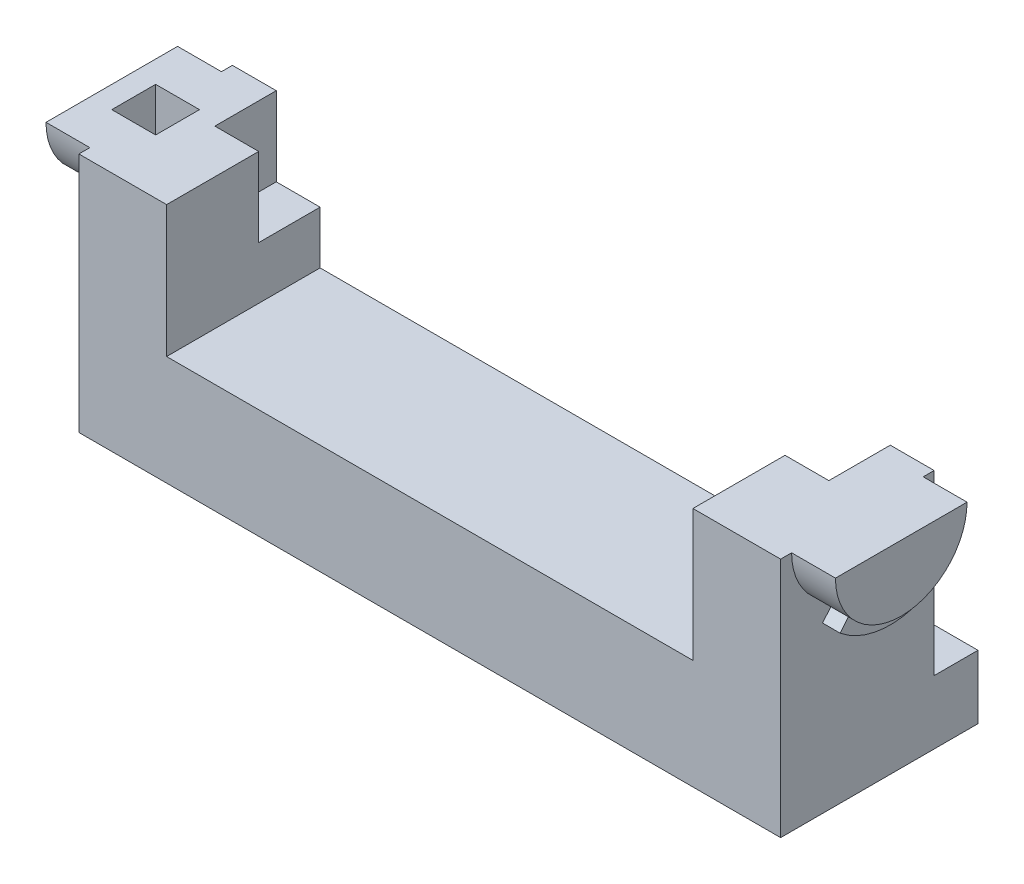
ISO-10303-21;
HEADER;
FILE_DESCRIPTION(('STEP AP214'),'2;1');
FILE_NAME('part.step','',(''),(''),'','','');
FILE_SCHEMA(('AUTOMOTIVE_DESIGN { 1 0 10303 214 1 1 1 1 }'));
ENDSEC;
DATA;
#1=APPLICATION_CONTEXT('core data for automotive mechanical design processes');
#2=APPLICATION_PROTOCOL_DEFINITION('international standard','automotive_design',2000,#1);
#3=PRODUCT_CONTEXT('',#1,'mechanical');
#4=PRODUCT('Part','Part','',(#3));
#5=PRODUCT_RELATED_PRODUCT_CATEGORY('part','',(#4));
#6=PRODUCT_DEFINITION_FORMATION('','',#4);
#7=PRODUCT_DEFINITION_CONTEXT('part definition',#1,'design');
#8=PRODUCT_DEFINITION('design','',#6,#7);
#9=PRODUCT_DEFINITION_SHAPE('','',#8);
#10=(LENGTH_UNIT() NAMED_UNIT(*) SI_UNIT(.MILLI.,.METRE.));
#11=(NAMED_UNIT(*) PLANE_ANGLE_UNIT() SI_UNIT($,.RADIAN.));
#12=(NAMED_UNIT(*) SI_UNIT($,.STERADIAN.) SOLID_ANGLE_UNIT());
#13=UNCERTAINTY_MEASURE_WITH_UNIT(LENGTH_MEASURE(1.E-05),#10,'distance_accuracy_value','');
#14=(GEOMETRIC_REPRESENTATION_CONTEXT(3) GLOBAL_UNCERTAINTY_ASSIGNED_CONTEXT((#13)) GLOBAL_UNIT_ASSIGNED_CONTEXT((#10,
#11,#12)) REPRESENTATION_CONTEXT('',''));
#15=CARTESIAN_POINT('',(0.,0.,0.));
#16=DIRECTION('',(0.,0.,1.));
#17=DIRECTION('',(1.,0.,0.));
#18=AXIS2_PLACEMENT_3D('',#15,#16,#17);
#19=CARTESIAN_POINT('',(0.,6.35,8.89));
#20=DIRECTION('',(0.,-1.,0.));
#21=DIRECTION('',(0.,0.,-1.));
#22=AXIS2_PLACEMENT_3D('',#19,#20,#21);
#23=PLANE('',#22);
#24=DIRECTION('',(0.,0.,1.));
#25=VECTOR('',#24,1.);
#26=CARTESIAN_POINT('',(35.56,6.35,8.89));
#27=LINE('',#26,#25);
#28=CARTESIAN_POINT('',(35.56,6.35,0.));
#29=VERTEX_POINT('',#28);
#30=CARTESIAN_POINT('',(35.56,6.35,8.89));
#31=VERTEX_POINT('',#30);
#32=EDGE_CURVE('E455',#29,#31,#27,.T.);
#33=ORIENTED_EDGE('',*,*,#32,.F.);
#34=DIRECTION('',(-1.,0.,0.));
#35=VECTOR('',#34,1.);
#36=CARTESIAN_POINT('',(0.,6.35,0.));
#37=LINE('',#36,#35);
#38=CARTESIAN_POINT('',(5.08,6.35,0.));
#39=VERTEX_POINT('',#38);
#40=EDGE_CURVE('E502',#29,#39,#37,.T.);
#41=ORIENTED_EDGE('',*,*,#40,.T.);
#42=DIRECTION('',(0.,0.,-1.));
#43=VECTOR('',#42,1.);
#44=CARTESIAN_POINT('',(5.08,6.35,8.89));
#45=LINE('',#44,#43);
#46=CARTESIAN_POINT('',(5.08,6.35,8.89));
#47=VERTEX_POINT('',#46);
#48=EDGE_CURVE('E478',#47,#39,#45,.T.);
#49=ORIENTED_EDGE('',*,*,#48,.F.);
#50=DIRECTION('',(-1.,0.,0.));
#51=VECTOR('',#50,1.);
#52=CARTESIAN_POINT('',(0.,6.35,8.89));
#53=LINE('',#52,#51);
#54=EDGE_CURVE('E506',#31,#47,#53,.T.);
#55=ORIENTED_EDGE('',*,*,#54,.F.);
#56=EDGE_LOOP('',(#33,#41,#49,#55));
#57=FACE_BOUND('',#56,.T.);
#58=ADVANCED_FACE('F51',(#57),#23,.F.);
#59=CARTESIAN_POINT('',(0.,0.,8.89));
#60=DIRECTION('',(1.,0.,0.));
#61=DIRECTION('',(0.,0.,-1.));
#62=AXIS2_PLACEMENT_3D('',#59,#60,#61);
#63=PLANE('',#62);
#64=CARTESIAN_POINT('',(0.,13.97,4.445));
#65=DIRECTION('',(-1.,0.,0.));
#66=DIRECTION('',(0.,0.,-1.));
#67=AXIS2_PLACEMENT_3D('',#64,#65,#66);
#68=CIRCLE('',#67,3.81);
#69=CARTESIAN_POINT('',(0.,13.97,0.635));
#70=VERTEX_POINT('',#69);
#71=CARTESIAN_POINT('',(0.,13.97,8.255));
#72=VERTEX_POINT('',#71);
#73=EDGE_CURVE('E421',#70,#72,#68,.T.);
#74=ORIENTED_EDGE('',*,*,#73,.F.);
#75=DIRECTION('',(0.,0.,1.));
#76=VECTOR('',#75,1.);
#77=CARTESIAN_POINT('',(0.,13.97,8.89));
#78=LINE('',#77,#76);
#79=CARTESIAN_POINT('',(0.,13.97,0.));
#80=VERTEX_POINT('',#79);
#81=EDGE_CURVE('E479',#80,#70,#78,.T.);
#82=ORIENTED_EDGE('',*,*,#81,.F.);
#83=DIRECTION('',(0.,-1.,0.));
#84=VECTOR('',#83,1.);
#85=CARTESIAN_POINT('',(0.,0.,0.));
#86=LINE('',#85,#84);
#87=CARTESIAN_POINT('',(0.,3.683,0.));
#88=VERTEX_POINT('',#87);
#89=EDGE_CURVE('E497',#80,#88,#86,.T.);
#90=ORIENTED_EDGE('',*,*,#89,.T.);
#91=DIRECTION('',(0.,0.,1.));
#92=VECTOR('',#91,1.);
#93=CARTESIAN_POINT('',(0.,3.683,-2.54));
#94=LINE('',#93,#92);
#95=CARTESIAN_POINT('',(0.,3.683,-2.54));
#96=VERTEX_POINT('',#95);
#97=EDGE_CURVE('E418',#96,#88,#94,.T.);
#98=ORIENTED_EDGE('',*,*,#97,.F.);
#99=DIRECTION('',(0.,1.,0.));
#100=VECTOR('',#99,1.);
#101=CARTESIAN_POINT('',(0.,0.,-2.54));
#102=LINE('',#101,#100);
#103=CARTESIAN_POINT('',(0.,0.,-2.54));
#104=VERTEX_POINT('',#103);
#105=EDGE_CURVE('E401',#104,#96,#102,.T.);
#106=ORIENTED_EDGE('',*,*,#105,.F.);
#107=DIRECTION('',(0.,0.,-1.));
#108=VECTOR('',#107,1.);
#109=CARTESIAN_POINT('',(0.,0.,8.89));
#110=LINE('',#109,#108);
#111=CARTESIAN_POINT('',(0.,0.,8.89));
#112=VERTEX_POINT('',#111);
#113=EDGE_CURVE('E12',#112,#104,#110,.T.);
#114=ORIENTED_EDGE('',*,*,#113,.F.);
#115=DIRECTION('',(0.,-1.,0.));
#116=VECTOR('',#115,1.);
#117=CARTESIAN_POINT('',(0.,0.,8.89));
#118=LINE('',#117,#116);
#119=CARTESIAN_POINT('',(0.,13.97,8.89));
#120=VERTEX_POINT('',#119);
#121=EDGE_CURVE('E498',#120,#112,#118,.T.);
#122=ORIENTED_EDGE('',*,*,#121,.F.);
#123=EDGE_CURVE('E483',#72,#120,#78,.T.);
#124=ORIENTED_EDGE('',*,*,#123,.F.);
#125=EDGE_LOOP('',(#74,#82,#90,#98,#106,#114,#122,#124));
#126=FACE_BOUND('',#125,.T.);
#127=ADVANCED_FACE('F53',(#126),#63,.F.);
#128=CARTESIAN_POINT('',(0.,0.,8.89));
#129=DIRECTION('',(0.,1.,0.));
#130=DIRECTION('',(0.,0.,1.));
#131=AXIS2_PLACEMENT_3D('',#128,#129,#130);
#132=PLANE('',#131);
#133=DIRECTION('',(-1.,0.,0.));
#134=VECTOR('',#133,1.);
#135=CARTESIAN_POINT('',(20.574,0.,3.81));
#136=LINE('',#135,#134);
#137=CARTESIAN_POINT('',(20.574,0.,3.81));
#138=VERTEX_POINT('',#137);
#139=CARTESIAN_POINT('',(20.066,0.,3.81));
#140=VERTEX_POINT('',#139);
#141=EDGE_CURVE('E313',#138,#140,#136,.T.);
#142=ORIENTED_EDGE('',*,*,#141,.F.);
#143=DIRECTION('',(0.,0.,1.));
#144=VECTOR('',#143,1.);
#145=CARTESIAN_POINT('',(20.574,0.,-2.54));
#146=LINE('',#145,#144);
#147=CARTESIAN_POINT('',(20.574,0.,-2.54));
#148=VERTEX_POINT('',#147);
#149=EDGE_CURVE('E297',#148,#138,#146,.T.);
#150=ORIENTED_EDGE('',*,*,#149,.F.);
#151=DIRECTION('',(-1.,0.,0.));
#152=VECTOR('',#151,1.);
#153=CARTESIAN_POINT('',(0.,0.,-2.54));
#154=LINE('',#153,#152);
#155=CARTESIAN_POINT('',(40.64,0.,-2.54));
#156=VERTEX_POINT('',#155);
#157=EDGE_CURVE('E410',#156,#148,#154,.T.);
#158=ORIENTED_EDGE('',*,*,#157,.F.);
#159=DIRECTION('',(0.,0.,-1.));
#160=VECTOR('',#159,1.);
#161=CARTESIAN_POINT('',(40.64,0.,8.89));
#162=LINE('',#161,#160);
#163=CARTESIAN_POINT('',(40.64,0.,8.89));
#164=VERTEX_POINT('',#163);
#165=EDGE_CURVE('E59',#164,#156,#162,.T.);
#166=ORIENTED_EDGE('',*,*,#165,.F.);
#167=DIRECTION('',(1.,0.,0.));
#168=VECTOR('',#167,1.);
#169=CARTESIAN_POINT('',(0.,0.,8.89));
#170=LINE('',#169,#168);
#171=EDGE_CURVE('E501',#112,#164,#170,.T.);
#172=ORIENTED_EDGE('',*,*,#171,.F.);
#173=ORIENTED_EDGE('',*,*,#113,.T.);
#174=CARTESIAN_POINT('',(20.066,0.,-2.54));
#175=VERTEX_POINT('',#174);
#176=EDGE_CURVE('E409',#175,#104,#154,.T.);
#177=ORIENTED_EDGE('',*,*,#176,.F.);
#178=DIRECTION('',(0.,0.,-1.));
#179=VECTOR('',#178,1.);
#180=CARTESIAN_POINT('',(20.066,0.,-2.54));
#181=LINE('',#180,#179);
#182=EDGE_CURVE('E305',#140,#175,#181,.T.);
#183=ORIENTED_EDGE('',*,*,#182,.F.);
#184=EDGE_LOOP('',(#142,#150,#158,#166,#172,#173,#177,#183));
#185=FACE_BOUND('',#184,.T.);
#186=ADVANCED_FACE('F528',(#185),#132,.F.);
#187=CARTESIAN_POINT('',(40.64,0.,8.89));
#188=DIRECTION('',(-1.,0.,0.));
#189=DIRECTION('',(0.,0.,1.));
#190=AXIS2_PLACEMENT_3D('',#187,#188,#189);
#191=PLANE('',#190);
#192=CARTESIAN_POINT('',(40.64,13.97,4.445));
#193=DIRECTION('',(1.,0.,0.));
#194=DIRECTION('',(0.,0.,-1.));
#195=AXIS2_PLACEMENT_3D('',#192,#193,#194);
#196=CIRCLE('',#195,3.81);
#197=CARTESIAN_POINT('',(40.64,13.97,8.255));
#198=VERTEX_POINT('',#197);
#199=CARTESIAN_POINT('',(40.64,13.97,0.635));
#200=VERTEX_POINT('',#199);
#201=EDGE_CURVE('E363',#198,#200,#196,.T.);
#202=ORIENTED_EDGE('',*,*,#201,.F.);
#203=DIRECTION('',(0.,0.,-1.));
#204=VECTOR('',#203,1.);
#205=CARTESIAN_POINT('',(40.64,13.97,8.89));
#206=LINE('',#205,#204);
#207=CARTESIAN_POINT('',(40.64,13.97,8.89));
#208=VERTEX_POINT('',#207);
#209=EDGE_CURVE('E459',#208,#198,#206,.T.);
#210=ORIENTED_EDGE('',*,*,#209,.F.);
#211=DIRECTION('',(0.,1.,0.));
#212=VECTOR('',#211,1.);
#213=CARTESIAN_POINT('',(40.64,0.,8.89));
#214=LINE('',#213,#212);
#215=EDGE_CURVE('E504',#164,#208,#214,.T.);
#216=ORIENTED_EDGE('',*,*,#215,.F.);
#217=ORIENTED_EDGE('',*,*,#165,.T.);
#218=DIRECTION('',(0.,-1.,0.));
#219=VECTOR('',#218,1.);
#220=CARTESIAN_POINT('',(40.64,0.,-2.54));
#221=LINE('',#220,#219);
#222=CARTESIAN_POINT('',(40.64,3.683,-2.54));
#223=VERTEX_POINT('',#222);
#224=EDGE_CURVE('E406',#223,#156,#221,.T.);
#225=ORIENTED_EDGE('',*,*,#224,.F.);
#226=DIRECTION('',(0.,0.,1.));
#227=VECTOR('',#226,1.);
#228=CARTESIAN_POINT('',(40.64,3.683,-2.54));
#229=LINE('',#228,#227);
#230=CARTESIAN_POINT('',(40.64,3.683,0.));
#231=VERTEX_POINT('',#230);
#232=EDGE_CURVE('E413',#223,#231,#229,.T.);
#233=ORIENTED_EDGE('',*,*,#232,.T.);
#234=DIRECTION('',(0.,1.,0.));
#235=VECTOR('',#234,1.);
#236=CARTESIAN_POINT('',(40.64,0.,0.));
#237=LINE('',#236,#235);
#238=CARTESIAN_POINT('',(40.64,13.97,0.));
#239=VERTEX_POINT('',#238);
#240=EDGE_CURVE('E510',#231,#239,#237,.T.);
#241=ORIENTED_EDGE('',*,*,#240,.T.);
#242=EDGE_CURVE('E463',#200,#239,#206,.T.);
#243=ORIENTED_EDGE('',*,*,#242,.F.);
#244=EDGE_LOOP('',(#202,#210,#216,#217,#225,#233,#241,#243));
#245=FACE_BOUND('',#244,.T.);
#246=ADVANCED_FACE('F518',(#245),#191,.F.);
#247=CARTESIAN_POINT('',(0.,0.,8.89));
#248=DIRECTION('',(0.,0.,-1.));
#249=DIRECTION('',(-1.,0.,0.));
#250=AXIS2_PLACEMENT_3D('',#247,#248,#249);
#251=PLANE('',#250);
#252=ORIENTED_EDGE('',*,*,#121,.T.);
#253=ORIENTED_EDGE('',*,*,#171,.T.);
#254=ORIENTED_EDGE('',*,*,#215,.T.);
#255=DIRECTION('',(1.,0.,0.));
#256=VECTOR('',#255,1.);
#257=CARTESIAN_POINT('',(40.64,13.97,8.89));
#258=LINE('',#257,#256);
#259=CARTESIAN_POINT('',(35.56,13.97,8.89));
#260=VERTEX_POINT('',#259);
#261=EDGE_CURVE('E468',#260,#208,#258,.T.);
#262=ORIENTED_EDGE('',*,*,#261,.F.);
#263=DIRECTION('',(0.,-1.,0.));
#264=VECTOR('',#263,1.);
#265=CARTESIAN_POINT('',(35.56,13.97,8.89));
#266=LINE('',#265,#264);
#267=EDGE_CURVE('E471',#260,#31,#266,.T.);
#268=ORIENTED_EDGE('',*,*,#267,.T.);
#269=ORIENTED_EDGE('',*,*,#54,.T.);
#270=DIRECTION('',(0.,-1.,0.));
#271=VECTOR('',#270,1.);
#272=CARTESIAN_POINT('',(5.08,13.97,8.89));
#273=LINE('',#272,#271);
#274=CARTESIAN_POINT('',(5.08,13.97,8.89));
#275=VERTEX_POINT('',#274);
#276=EDGE_CURVE('E494',#275,#47,#273,.T.);
#277=ORIENTED_EDGE('',*,*,#276,.F.);
#278=DIRECTION('',(1.,0.,0.));
#279=VECTOR('',#278,1.);
#280=CARTESIAN_POINT('',(0.,13.97,8.89));
#281=LINE('',#280,#279);
#282=EDGE_CURVE('E482',#120,#275,#281,.T.);
#283=ORIENTED_EDGE('',*,*,#282,.F.);
#284=EDGE_LOOP('',(#252,#253,#254,#262,#268,#269,#277,#283));
#285=FACE_BOUND('',#284,.T.);
#286=ADVANCED_FACE('F565',(#285),#251,.F.);
#287=CARTESIAN_POINT('',(0.,0.,0.));
#288=DIRECTION('',(0.,0.,-1.));
#289=DIRECTION('',(-1.,0.,0.));
#290=AXIS2_PLACEMENT_3D('',#287,#288,#289);
#291=PLANE('',#290);
#292=DIRECTION('',(-1.,0.,0.));
#293=VECTOR('',#292,1.);
#294=CARTESIAN_POINT('',(38.1,10.414,0.));
#295=LINE('',#294,#293);
#296=CARTESIAN_POINT('',(38.1,10.414,0.));
#297=VERTEX_POINT('',#296);
#298=CARTESIAN_POINT('',(35.56,10.414,0.));
#299=VERTEX_POINT('',#298);
#300=EDGE_CURVE('E390',#297,#299,#295,.T.);
#301=ORIENTED_EDGE('',*,*,#300,.F.);
#302=DIRECTION('',(0.,-1.,0.));
#303=VECTOR('',#302,1.);
#304=CARTESIAN_POINT('',(38.1,13.97,0.));
#305=LINE('',#304,#303);
#306=CARTESIAN_POINT('',(38.1,13.97,0.));
#307=VERTEX_POINT('',#306);
#308=EDGE_CURVE('E379',#307,#297,#305,.T.);
#309=ORIENTED_EDGE('',*,*,#308,.F.);
#310=DIRECTION('',(-1.,0.,0.));
#311=VECTOR('',#310,1.);
#312=CARTESIAN_POINT('',(40.64,13.97,0.));
#313=LINE('',#312,#311);
#314=EDGE_CURVE('E462',#239,#307,#313,.T.);
#315=ORIENTED_EDGE('',*,*,#314,.F.);
#316=ORIENTED_EDGE('',*,*,#240,.F.);
#317=DIRECTION('',(1.,0.,0.));
#318=VECTOR('',#317,1.);
#319=CARTESIAN_POINT('',(0.,3.683,0.));
#320=LINE('',#319,#318);
#321=EDGE_CURVE('E397',#88,#231,#320,.T.);
#322=ORIENTED_EDGE('',*,*,#321,.F.);
#323=ORIENTED_EDGE('',*,*,#89,.F.);
#324=DIRECTION('',(-1.,0.,0.));
#325=VECTOR('',#324,1.);
#326=CARTESIAN_POINT('',(0.,13.97,0.));
#327=LINE('',#326,#325);
#328=CARTESIAN_POINT('',(2.54,13.97,0.));
#329=VERTEX_POINT('',#328);
#330=EDGE_CURVE('E488',#329,#80,#327,.T.);
#331=ORIENTED_EDGE('',*,*,#330,.F.);
#332=DIRECTION('',(0.,1.,0.));
#333=VECTOR('',#332,1.);
#334=CARTESIAN_POINT('',(2.54,13.97,0.));
#335=LINE('',#334,#333);
#336=CARTESIAN_POINT('',(2.54,9.398,0.));
#337=VERTEX_POINT('',#336);
#338=EDGE_CURVE('E436',#337,#329,#335,.T.);
#339=ORIENTED_EDGE('',*,*,#338,.F.);
#340=DIRECTION('',(1.,0.,0.));
#341=VECTOR('',#340,1.);
#342=CARTESIAN_POINT('',(2.54,9.398,0.));
#343=LINE('',#342,#341);
#344=CARTESIAN_POINT('',(5.08,9.398,0.));
#345=VERTEX_POINT('',#344);
#346=EDGE_CURVE('E452',#337,#345,#343,.T.);
#347=ORIENTED_EDGE('',*,*,#346,.T.);
#348=DIRECTION('',(0.,-1.,0.));
#349=VECTOR('',#348,1.);
#350=CARTESIAN_POINT('',(5.08,13.97,0.));
#351=LINE('',#350,#349);
#352=EDGE_CURVE('E490',#345,#39,#351,.T.);
#353=ORIENTED_EDGE('',*,*,#352,.T.);
#354=ORIENTED_EDGE('',*,*,#40,.F.);
#355=DIRECTION('',(0.,-1.,0.));
#356=VECTOR('',#355,1.);
#357=CARTESIAN_POINT('',(35.56,13.97,0.));
#358=LINE('',#357,#356);
#359=EDGE_CURVE('E476',#299,#29,#358,.T.);
#360=ORIENTED_EDGE('',*,*,#359,.F.);
#361=EDGE_LOOP('',(#301,#309,#315,#316,#322,#323,#331,#339,#347,#353,#354,#360));
#362=FACE_BOUND('',#361,.T.);
#363=ADVANCED_FACE('F552',(#362),#291,.T.);
#364=CARTESIAN_POINT('',(5.08,13.97,8.89));
#365=DIRECTION('',(-1.,0.,0.));
#366=DIRECTION('',(0.,0.,1.));
#367=AXIS2_PLACEMENT_3D('',#364,#365,#366);
#368=PLANE('',#367);
#369=ORIENTED_EDGE('',*,*,#352,.F.);
#370=DIRECTION('',(0.,0.,-1.));
#371=VECTOR('',#370,1.);
#372=CARTESIAN_POINT('',(5.08,9.398,0.));
#373=LINE('',#372,#371);
#374=CARTESIAN_POINT('',(5.08,9.398,3.556));
#375=VERTEX_POINT('',#374);
#376=EDGE_CURVE('E439',#375,#345,#373,.T.);
#377=ORIENTED_EDGE('',*,*,#376,.F.);
#378=DIRECTION('',(0.,-1.,0.));
#379=VECTOR('',#378,1.);
#380=CARTESIAN_POINT('',(5.08,13.97,3.556));
#381=LINE('',#380,#379);
#382=CARTESIAN_POINT('',(5.08,13.97,3.556));
#383=VERTEX_POINT('',#382);
#384=EDGE_CURVE('E435',#383,#375,#381,.T.);
#385=ORIENTED_EDGE('',*,*,#384,.F.);
#386=DIRECTION('',(0.,0.,-1.));
#387=VECTOR('',#386,1.);
#388=CARTESIAN_POINT('',(5.08,13.97,8.89));
#389=LINE('',#388,#387);
#390=EDGE_CURVE('E485',#275,#383,#389,.T.);
#391=ORIENTED_EDGE('',*,*,#390,.F.);
#392=ORIENTED_EDGE('',*,*,#276,.T.);
#393=ORIENTED_EDGE('',*,*,#48,.T.);
#394=EDGE_LOOP('',(#369,#377,#385,#391,#392,#393));
#395=FACE_BOUND('',#394,.T.);
#396=ADVANCED_FACE('F589',(#395),#368,.F.);
#397=CARTESIAN_POINT('',(0.,13.97,0.));
#398=DIRECTION('',(0.,-1.,0.));
#399=DIRECTION('',(0.,0.,-1.));
#400=AXIS2_PLACEMENT_3D('',#397,#398,#399);
#401=PLANE('',#400);
#402=DIRECTION('',(1.,0.,0.));
#403=VECTOR('',#402,1.);
#404=CARTESIAN_POINT('',(-1.27,13.97,5.715));
#405=LINE('',#404,#403);
#406=CARTESIAN_POINT('',(-1.27,13.97,5.715));
#407=VERTEX_POINT('',#406);
#408=CARTESIAN_POINT('',(1.27,13.97,5.715));
#409=VERTEX_POINT('',#408);
#410=EDGE_CURVE('E291',#407,#409,#405,.T.);
#411=ORIENTED_EDGE('',*,*,#410,.F.);
#412=DIRECTION('',(0.,0.,1.));
#413=VECTOR('',#412,1.);
#414=CARTESIAN_POINT('',(-1.27,13.97,5.715));
#415=LINE('',#414,#413);
#416=CARTESIAN_POINT('',(-1.27,13.97,3.175));
#417=VERTEX_POINT('',#416);
#418=EDGE_CURVE('E66',#417,#407,#415,.T.);
#419=ORIENTED_EDGE('',*,*,#418,.F.);
#420=DIRECTION('',(-1.,0.,0.));
#421=VECTOR('',#420,1.);
#422=CARTESIAN_POINT('',(-1.27,13.97,3.175));
#423=LINE('',#422,#421);
#424=CARTESIAN_POINT('',(1.27,13.97,3.175));
#425=VERTEX_POINT('',#424);
#426=EDGE_CURVE('E282',#425,#417,#423,.T.);
#427=ORIENTED_EDGE('',*,*,#426,.F.);
#428=DIRECTION('',(0.,0.,-1.));
#429=VECTOR('',#428,1.);
#430=CARTESIAN_POINT('',(1.27,13.97,5.715));
#431=LINE('',#430,#429);
#432=EDGE_CURVE('E285',#409,#425,#431,.T.);
#433=ORIENTED_EDGE('',*,*,#432,.F.);
#434=EDGE_LOOP('',(#411,#419,#427,#433));
#435=FACE_BOUND('',#434,.T.);
#436=ORIENTED_EDGE('',*,*,#390,.T.);
#437=DIRECTION('',(1.,0.,0.));
#438=VECTOR('',#437,1.);
#439=CARTESIAN_POINT('',(2.54,13.97,3.556));
#440=LINE('',#439,#438);
#441=CARTESIAN_POINT('',(2.54,13.97,3.556));
#442=VERTEX_POINT('',#441);
#443=EDGE_CURVE('E448',#442,#383,#440,.T.);
#444=ORIENTED_EDGE('',*,*,#443,.F.);
#445=DIRECTION('',(0.,0.,1.));
#446=VECTOR('',#445,1.);
#447=CARTESIAN_POINT('',(2.54,13.97,0.));
#448=LINE('',#447,#446);
#449=EDGE_CURVE('E438',#329,#442,#448,.T.);
#450=ORIENTED_EDGE('',*,*,#449,.F.);
#451=ORIENTED_EDGE('',*,*,#330,.T.);
#452=ORIENTED_EDGE('',*,*,#81,.T.);
#453=DIRECTION('',(1.,0.,0.));
#454=VECTOR('',#453,1.);
#455=CARTESIAN_POINT('',(-2.54,13.97,0.635));
#456=LINE('',#455,#454);
#457=CARTESIAN_POINT('',(-2.54,13.97,0.635));
#458=VERTEX_POINT('',#457);
#459=EDGE_CURVE('E427',#458,#70,#456,.T.);
#460=ORIENTED_EDGE('',*,*,#459,.F.);
#461=DIRECTION('',(0.,0.,-1.));
#462=VECTOR('',#461,1.);
#463=CARTESIAN_POINT('',(-2.54,13.97,8.255));
#464=LINE('',#463,#462);
#465=CARTESIAN_POINT('',(-2.54,13.97,8.255));
#466=VERTEX_POINT('',#465);
#467=EDGE_CURVE('E425',#466,#458,#464,.T.);
#468=ORIENTED_EDGE('',*,*,#467,.F.);
#469=DIRECTION('',(1.,0.,0.));
#470=VECTOR('',#469,1.);
#471=CARTESIAN_POINT('',(-2.54,13.97,8.255));
#472=LINE('',#471,#470);
#473=EDGE_CURVE('E432',#466,#72,#472,.T.);
#474=ORIENTED_EDGE('',*,*,#473,.T.);
#475=ORIENTED_EDGE('',*,*,#123,.T.);
#476=ORIENTED_EDGE('',*,*,#282,.T.);
#477=EDGE_LOOP('',(#436,#444,#450,#451,#452,#460,#468,#474,#475,#476));
#478=FACE_BOUND('',#477,.T.);
#479=ADVANCED_FACE('F571',(#435,#478),#401,.F.);
#480=CARTESIAN_POINT('',(35.56,13.97,8.89));
#481=DIRECTION('',(1.,0.,0.));
#482=DIRECTION('',(0.,0.,-1.));
#483=AXIS2_PLACEMENT_3D('',#480,#481,#482);
#484=PLANE('',#483);
#485=DIRECTION('',(0.,0.,1.));
#486=VECTOR('',#485,1.);
#487=CARTESIAN_POINT('',(35.56,13.97,8.89));
#488=LINE('',#487,#486);
#489=CARTESIAN_POINT('',(35.56,13.97,3.556));
#490=VERTEX_POINT('',#489);
#491=EDGE_CURVE('E466',#490,#260,#488,.T.);
#492=ORIENTED_EDGE('',*,*,#491,.F.);
#493=DIRECTION('',(0.,1.,0.));
#494=VECTOR('',#493,1.);
#495=CARTESIAN_POINT('',(35.56,13.97,3.556));
#496=LINE('',#495,#494);
#497=CARTESIAN_POINT('',(35.56,10.414,3.556));
#498=VERTEX_POINT('',#497);
#499=EDGE_CURVE('E383',#498,#490,#496,.T.);
#500=ORIENTED_EDGE('',*,*,#499,.F.);
#501=DIRECTION('',(0.,0.,1.));
#502=VECTOR('',#501,1.);
#503=CARTESIAN_POINT('',(35.56,10.414,0.));
#504=LINE('',#503,#502);
#505=EDGE_CURVE('E378',#299,#498,#504,.T.);
#506=ORIENTED_EDGE('',*,*,#505,.F.);
#507=ORIENTED_EDGE('',*,*,#359,.T.);
#508=ORIENTED_EDGE('',*,*,#32,.T.);
#509=ORIENTED_EDGE('',*,*,#267,.F.);
#510=EDGE_LOOP('',(#492,#500,#506,#507,#508,#509));
#511=FACE_BOUND('',#510,.T.);
#512=ADVANCED_FACE('F597',(#511),#484,.F.);
#513=CARTESIAN_POINT('',(0.,13.97,0.));
#514=DIRECTION('',(0.,1.,0.));
#515=DIRECTION('',(0.,0.,1.));
#516=AXIS2_PLACEMENT_3D('',#513,#514,#515);
#517=PLANE('',#516);
#518=DIRECTION('',(-1.,0.,0.));
#519=VECTOR('',#518,1.);
#520=CARTESIAN_POINT('',(38.1,13.97,3.556));
#521=LINE('',#520,#519);
#522=CARTESIAN_POINT('',(38.1,13.97,3.556));
#523=VERTEX_POINT('',#522);
#524=EDGE_CURVE('E394',#523,#490,#521,.T.);
#525=ORIENTED_EDGE('',*,*,#524,.T.);
#526=ORIENTED_EDGE('',*,*,#491,.T.);
#527=ORIENTED_EDGE('',*,*,#261,.T.);
#528=ORIENTED_EDGE('',*,*,#209,.T.);
#529=DIRECTION('',(-1.,0.,0.));
#530=VECTOR('',#529,1.);
#531=CARTESIAN_POINT('',(43.18,13.97,8.255));
#532=LINE('',#531,#530);
#533=CARTESIAN_POINT('',(43.18,13.97,8.255));
#534=VERTEX_POINT('',#533);
#535=EDGE_CURVE('E370',#534,#198,#532,.T.);
#536=ORIENTED_EDGE('',*,*,#535,.F.);
#537=DIRECTION('',(0.,0.,1.));
#538=VECTOR('',#537,1.);
#539=CARTESIAN_POINT('',(43.18,13.97,0.635));
#540=LINE('',#539,#538);
#541=CARTESIAN_POINT('',(43.18,13.97,0.635));
#542=VERTEX_POINT('',#541);
#543=EDGE_CURVE('E368',#542,#534,#540,.T.);
#544=ORIENTED_EDGE('',*,*,#543,.F.);
#545=DIRECTION('',(-1.,0.,0.));
#546=VECTOR('',#545,1.);
#547=CARTESIAN_POINT('',(43.18,13.97,0.635));
#548=LINE('',#547,#546);
#549=EDGE_CURVE('E375',#542,#200,#548,.T.);
#550=ORIENTED_EDGE('',*,*,#549,.T.);
#551=ORIENTED_EDGE('',*,*,#242,.T.);
#552=ORIENTED_EDGE('',*,*,#314,.T.);
#553=DIRECTION('',(0.,0.,-1.));
#554=VECTOR('',#553,1.);
#555=CARTESIAN_POINT('',(38.1,13.97,0.));
#556=LINE('',#555,#554);
#557=EDGE_CURVE('E388',#523,#307,#556,.T.);
#558=ORIENTED_EDGE('',*,*,#557,.F.);
#559=EDGE_LOOP('',(#525,#526,#527,#528,#536,#544,#550,#551,#552,#558));
#560=FACE_BOUND('',#559,.T.);
#561=ADVANCED_FACE('F555',(#560),#517,.T.);
#562=CARTESIAN_POINT('',(2.54,9.398,0.));
#563=DIRECTION('',(0.,-1.,0.));
#564=DIRECTION('',(0.,0.,-1.));
#565=AXIS2_PLACEMENT_3D('',#562,#563,#564);
#566=PLANE('',#565);
#567=ORIENTED_EDGE('',*,*,#376,.T.);
#568=ORIENTED_EDGE('',*,*,#346,.F.);
#569=DIRECTION('',(0.,0.,-1.));
#570=VECTOR('',#569,1.);
#571=CARTESIAN_POINT('',(2.54,9.398,0.));
#572=LINE('',#571,#570);
#573=CARTESIAN_POINT('',(2.54,9.398,3.556));
#574=VERTEX_POINT('',#573);
#575=EDGE_CURVE('E445',#574,#337,#572,.T.);
#576=ORIENTED_EDGE('',*,*,#575,.F.);
#577=DIRECTION('',(1.,0.,0.));
#578=VECTOR('',#577,1.);
#579=CARTESIAN_POINT('',(2.54,9.398,3.556));
#580=LINE('',#579,#578);
#581=EDGE_CURVE('E456',#574,#375,#580,.T.);
#582=ORIENTED_EDGE('',*,*,#581,.T.);
#583=EDGE_LOOP('',(#567,#568,#576,#582));
#584=FACE_BOUND('',#583,.T.);
#585=ADVANCED_FACE('F585',(#584),#566,.F.);
#586=CARTESIAN_POINT('',(2.54,13.97,3.556));
#587=DIRECTION('',(0.,0.,1.));
#588=DIRECTION('',(0.,-1.,0.));
#589=AXIS2_PLACEMENT_3D('',#586,#587,#588);
#590=PLANE('',#589);
#591=ORIENTED_EDGE('',*,*,#384,.T.);
#592=ORIENTED_EDGE('',*,*,#581,.F.);
#593=DIRECTION('',(0.,-1.,0.));
#594=VECTOR('',#593,1.);
#595=CARTESIAN_POINT('',(2.54,13.97,3.556));
#596=LINE('',#595,#594);
#597=EDGE_CURVE('E442',#442,#574,#596,.T.);
#598=ORIENTED_EDGE('',*,*,#597,.F.);
#599=ORIENTED_EDGE('',*,*,#443,.T.);
#600=EDGE_LOOP('',(#591,#592,#598,#599));
#601=FACE_BOUND('',#600,.T.);
#602=ADVANCED_FACE('F683',(#601),#590,.F.);
#603=CARTESIAN_POINT('',(2.54,0.,0.));
#604=DIRECTION('',(-1.,0.,0.));
#605=DIRECTION('',(0.,0.,1.));
#606=AXIS2_PLACEMENT_3D('',#603,#604,#605);
#607=PLANE('',#606);
#608=ORIENTED_EDGE('',*,*,#338,.T.);
#609=ORIENTED_EDGE('',*,*,#449,.T.);
#610=ORIENTED_EDGE('',*,*,#597,.T.);
#611=ORIENTED_EDGE('',*,*,#575,.T.);
#612=EDGE_LOOP('',(#608,#609,#610,#611));
#613=FACE_BOUND('',#612,.T.);
#614=ADVANCED_FACE('F582',(#613),#607,.F.);
#615=CARTESIAN_POINT('',(-2.54,13.97,4.445));
#616=DIRECTION('',(1.,0.,0.));
#617=DIRECTION('',(0.,0.,-1.));
#618=AXIS2_PLACEMENT_3D('',#615,#616,#617);
#619=CYLINDRICAL_SURFACE('',#618,3.81);
#620=ORIENTED_EDGE('',*,*,#73,.T.);
#621=ORIENTED_EDGE('',*,*,#473,.F.);
#622=CARTESIAN_POINT('',(-2.54,13.97,4.445));
#623=DIRECTION('',(-1.,0.,0.));
#624=DIRECTION('',(0.,0.,-1.));
#625=AXIS2_PLACEMENT_3D('',#622,#623,#624);
#626=CIRCLE('',#625,3.81);
#627=EDGE_CURVE('E422',#458,#466,#626,.T.);
#628=ORIENTED_EDGE('',*,*,#627,.F.);
#629=ORIENTED_EDGE('',*,*,#459,.T.);
#630=EDGE_LOOP('',(#620,#621,#628,#629));
#631=FACE_BOUND('',#630,.T.);
#632=ADVANCED_FACE('F575',(#631),#619,.T.);
#633=CARTESIAN_POINT('',(-2.54,13.97,4.445));
#634=DIRECTION('',(1.,0.,0.));
#635=DIRECTION('',(0.,0.,-1.));
#636=AXIS2_PLACEMENT_3D('',#633,#634,#635);
#637=PLANE('',#636);
#638=ORIENTED_EDGE('',*,*,#627,.T.);
#639=ORIENTED_EDGE('',*,*,#467,.T.);
#640=EDGE_LOOP('',(#638,#639));
#641=FACE_BOUND('',#640,.T.);
#642=ADVANCED_FACE('F703',(#641),#637,.F.);
#643=CARTESIAN_POINT('',(0.,3.683,-2.54));
#644=DIRECTION('',(0.,-1.,0.));
#645=DIRECTION('',(0.,0.,-1.));
#646=AXIS2_PLACEMENT_3D('',#643,#644,#645);
#647=PLANE('',#646);
#648=ORIENTED_EDGE('',*,*,#321,.T.);
#649=ORIENTED_EDGE('',*,*,#232,.F.);
#650=DIRECTION('',(1.,0.,0.));
#651=VECTOR('',#650,1.);
#652=CARTESIAN_POINT('',(0.,3.683,-2.54));
#653=LINE('',#652,#651);
#654=EDGE_CURVE('E404',#96,#223,#653,.T.);
#655=ORIENTED_EDGE('',*,*,#654,.F.);
#656=ORIENTED_EDGE('',*,*,#97,.T.);
#657=EDGE_LOOP('',(#648,#649,#655,#656));
#658=FACE_BOUND('',#657,.T.);
#659=ADVANCED_FACE('F547',(#658),#647,.F.);
#660=CARTESIAN_POINT('',(0.,0.,-2.54));
#661=DIRECTION('',(0.,0.,-1.));
#662=DIRECTION('',(-1.,0.,0.));
#663=AXIS2_PLACEMENT_3D('',#660,#661,#662);
#664=PLANE('',#663);
#665=DIRECTION('',(0.,-1.,0.));
#666=VECTOR('',#665,1.);
#667=CARTESIAN_POINT('',(20.574,1.27,-2.54));
#668=LINE('',#667,#666);
#669=CARTESIAN_POINT('',(20.574,1.27,-2.54));
#670=VERTEX_POINT('',#669);
#671=EDGE_CURVE('E317',#670,#148,#668,.T.);
#672=ORIENTED_EDGE('',*,*,#671,.F.);
#673=DIRECTION('',(1.,0.,0.));
#674=VECTOR('',#673,1.);
#675=CARTESIAN_POINT('',(20.574,1.27,-2.54));
#676=LINE('',#675,#674);
#677=CARTESIAN_POINT('',(20.066,1.27,-2.54));
#678=VERTEX_POINT('',#677);
#679=EDGE_CURVE('E308',#678,#670,#676,.T.);
#680=ORIENTED_EDGE('',*,*,#679,.F.);
#681=DIRECTION('',(0.,-1.,0.));
#682=VECTOR('',#681,1.);
#683=CARTESIAN_POINT('',(20.066,1.27,-2.54));
#684=LINE('',#683,#682);
#685=EDGE_CURVE('E320',#678,#175,#684,.T.);
#686=ORIENTED_EDGE('',*,*,#685,.T.);
#687=ORIENTED_EDGE('',*,*,#176,.T.);
#688=ORIENTED_EDGE('',*,*,#105,.T.);
#689=ORIENTED_EDGE('',*,*,#654,.T.);
#690=ORIENTED_EDGE('',*,*,#224,.T.);
#691=ORIENTED_EDGE('',*,*,#157,.T.);
#692=EDGE_LOOP('',(#672,#680,#686,#687,#688,#689,#690,#691));
#693=FACE_BOUND('',#692,.T.);
#694=ADVANCED_FACE('F524',(#693),#664,.T.);
#695=CARTESIAN_POINT('',(38.1,13.97,3.556));
#696=DIRECTION('',(0.,0.,1.));
#697=DIRECTION('',(0.,-1.,0.));
#698=AXIS2_PLACEMENT_3D('',#695,#696,#697);
#699=PLANE('',#698);
#700=ORIENTED_EDGE('',*,*,#499,.T.);
#701=ORIENTED_EDGE('',*,*,#524,.F.);
#702=DIRECTION('',(0.,1.,0.));
#703=VECTOR('',#702,1.);
#704=CARTESIAN_POINT('',(38.1,13.97,3.556));
#705=LINE('',#704,#703);
#706=CARTESIAN_POINT('',(38.1,10.414,3.556));
#707=VERTEX_POINT('',#706);
#708=EDGE_CURVE('E386',#707,#523,#705,.T.);
#709=ORIENTED_EDGE('',*,*,#708,.F.);
#710=DIRECTION('',(-1.,0.,0.));
#711=VECTOR('',#710,1.);
#712=CARTESIAN_POINT('',(38.1,10.414,3.556));
#713=LINE('',#712,#711);
#714=EDGE_CURVE('E398',#707,#498,#713,.T.);
#715=ORIENTED_EDGE('',*,*,#714,.T.);
#716=EDGE_LOOP('',(#700,#701,#709,#715));
#717=FACE_BOUND('',#716,.T.);
#718=ADVANCED_FACE('F607',(#717),#699,.F.);
#719=CARTESIAN_POINT('',(38.1,10.414,0.));
#720=DIRECTION('',(0.,-1.,0.));
#721=DIRECTION('',(0.,0.,-1.));
#722=AXIS2_PLACEMENT_3D('',#719,#720,#721);
#723=PLANE('',#722);
#724=ORIENTED_EDGE('',*,*,#505,.T.);
#725=ORIENTED_EDGE('',*,*,#714,.F.);
#726=DIRECTION('',(0.,0.,1.));
#727=VECTOR('',#726,1.);
#728=CARTESIAN_POINT('',(38.1,10.414,0.));
#729=LINE('',#728,#727);
#730=EDGE_CURVE('E382',#297,#707,#729,.T.);
#731=ORIENTED_EDGE('',*,*,#730,.F.);
#732=ORIENTED_EDGE('',*,*,#300,.T.);
#733=EDGE_LOOP('',(#724,#725,#731,#732));
#734=FACE_BOUND('',#733,.T.);
#735=ADVANCED_FACE('F601',(#734),#723,.F.);
#736=CARTESIAN_POINT('',(38.1,0.,0.));
#737=DIRECTION('',(-1.,0.,0.));
#738=DIRECTION('',(0.,0.,1.));
#739=AXIS2_PLACEMENT_3D('',#736,#737,#738);
#740=PLANE('',#739);
#741=ORIENTED_EDGE('',*,*,#308,.T.);
#742=ORIENTED_EDGE('',*,*,#730,.T.);
#743=ORIENTED_EDGE('',*,*,#708,.T.);
#744=ORIENTED_EDGE('',*,*,#557,.T.);
#745=EDGE_LOOP('',(#741,#742,#743,#744));
#746=FACE_BOUND('',#745,.T.);
#747=ADVANCED_FACE('F604',(#746),#740,.T.);
#748=CARTESIAN_POINT('',(43.18,13.97,4.445));
#749=DIRECTION('',(-1.,0.,0.));
#750=DIRECTION('',(0.,0.,1.));
#751=AXIS2_PLACEMENT_3D('',#748,#749,#750);
#752=CYLINDRICAL_SURFACE('',#751,3.81);
#753=DIRECTION('',(-1.,0.,0.));
#754=VECTOR('',#753,1.);
#755=CARTESIAN_POINT('',(42.545,10.9250622827147,2.15492264369665));
#756=LINE('',#755,#754);
#757=CARTESIAN_POINT('',(42.545,10.9250622827147,2.15492264369665));
#758=VERTEX_POINT('',#757);
#759=CARTESIAN_POINT('',(41.529,10.9250622827147,2.15492264369665));
#760=VERTEX_POINT('',#759);
#761=EDGE_CURVE('E331',#758,#760,#756,.T.);
#762=ORIENTED_EDGE('',*,*,#761,.T.);
#763=CARTESIAN_POINT('',(41.529,13.97,4.445));
#764=DIRECTION('',(-1.,0.,0.));
#765=DIRECTION('',(0.,-0.772203868534924,0.635374838516366));
#766=AXIS2_PLACEMENT_3D('',#763,#764,#765);
#767=CIRCLE('',#766,3.81);
#768=CARTESIAN_POINT('',(41.529,11.0279032608819,6.86577813474735));
#769=VERTEX_POINT('',#768);
#770=EDGE_CURVE('E348',#760,#769,#767,.T.);
#771=ORIENTED_EDGE('',*,*,#770,.T.);
#772=DIRECTION('',(1.,0.,0.));
#773=VECTOR('',#772,1.);
#774=CARTESIAN_POINT('',(41.529,11.0279032608819,6.86577813474735));
#775=LINE('',#774,#773);
#776=CARTESIAN_POINT('',(42.545,11.0279032608819,6.86577813474735));
#777=VERTEX_POINT('',#776);
#778=EDGE_CURVE('E344',#769,#777,#775,.T.);
#779=ORIENTED_EDGE('',*,*,#778,.T.);
#780=CARTESIAN_POINT('',(42.545,13.97,4.445));
#781=DIRECTION('',(-1.,0.,0.));
#782=DIRECTION('',(0.,-0.772203868534924,0.635374838516366));
#783=AXIS2_PLACEMENT_3D('',#780,#781,#782);
#784=CIRCLE('',#783,3.81);
#785=EDGE_CURVE('E319',#758,#777,#784,.T.);
#786=ORIENTED_EDGE('',*,*,#785,.F.);
#787=EDGE_LOOP('',(#762,#771,#779,#786));
#788=FACE_BOUND('',#787,.T.);
#789=ORIENTED_EDGE('',*,*,#201,.T.);
#790=ORIENTED_EDGE('',*,*,#549,.F.);
#791=CARTESIAN_POINT('',(43.18,13.97,4.445));
#792=DIRECTION('',(1.,0.,0.));
#793=DIRECTION('',(0.,0.,-1.));
#794=AXIS2_PLACEMENT_3D('',#791,#792,#793);
#795=CIRCLE('',#794,3.81);
#796=EDGE_CURVE('E365',#534,#542,#795,.T.);
#797=ORIENTED_EDGE('',*,*,#796,.F.);
#798=ORIENTED_EDGE('',*,*,#535,.T.);
#799=EDGE_LOOP('',(#789,#790,#797,#798));
#800=FACE_BOUND('',#799,.T.);
#801=ADVANCED_FACE('F560',(#788,#800),#752,.T.);
#802=CARTESIAN_POINT('',(43.18,13.97,4.445));
#803=DIRECTION('',(1.,0.,0.));
#804=DIRECTION('',(0.,0.,-1.));
#805=AXIS2_PLACEMENT_3D('',#802,#803,#804);
#806=PLANE('',#805);
#807=ORIENTED_EDGE('',*,*,#796,.T.);
#808=ORIENTED_EDGE('',*,*,#543,.T.);
#809=EDGE_LOOP('',(#807,#808));
#810=FACE_BOUND('',#809,.T.);
#811=ADVANCED_FACE('F816',(#810),#806,.T.);
#812=CARTESIAN_POINT('',(41.529,13.97,4.445));
#813=DIRECTION('',(1.,0.,0.));
#814=DIRECTION('',(0.,0.,-1.));
#815=AXIS2_PLACEMENT_3D('',#812,#813,#814);
#816=PLANE('',#815);
#817=DIRECTION('',(0.,-0.772203868534924,0.635374838516366));
#818=VECTOR('',#817,1.);
#819=CARTESIAN_POINT('',(41.529,11.0279032608819,6.86577813474735));
#820=LINE('',#819,#818);
#821=CARTESIAN_POINT('',(41.529,10.4394839130583,7.34993376169682));
#822=VERTEX_POINT('',#821);
#823=EDGE_CURVE('E361',#769,#822,#820,.T.);
#824=ORIENTED_EDGE('',*,*,#823,.F.);
#825=ORIENTED_EDGE('',*,*,#770,.F.);
#826=DIRECTION('',(0.,-0.799196251255986,-0.601070172258098));
#827=VECTOR('',#826,1.);
#828=CARTESIAN_POINT('',(41.529,10.9250622827147,2.15492264369665));
#829=LINE('',#828,#827);
#830=CARTESIAN_POINT('',(41.529,10.3160747392576,1.69690717243598));
#831=VERTEX_POINT('',#830);
#832=EDGE_CURVE('E359',#760,#831,#829,.T.);
#833=ORIENTED_EDGE('',*,*,#832,.T.);
#834=CARTESIAN_POINT('',(41.529,13.97,4.445));
#835=DIRECTION('',(-1.,0.,0.));
#836=DIRECTION('',(0.,0.,1.));
#837=AXIS2_PLACEMENT_3D('',#834,#835,#836);
#838=CIRCLE('',#837,4.572);
#839=EDGE_CURVE('E337',#831,#822,#838,.T.);
#840=ORIENTED_EDGE('',*,*,#839,.T.);
#841=EDGE_LOOP('',(#824,#825,#833,#840));
#842=FACE_BOUND('',#841,.T.);
#843=ADVANCED_FACE('F812',(#842),#816,.F.);
#844=CARTESIAN_POINT('',(42.037,10.9250622827147,2.15492264369665));
#845=DIRECTION('',(0.,-0.601070172258097,0.799196251255986));
#846=DIRECTION('',(-1.,0.,0.));
#847=AXIS2_PLACEMENT_3D('',#844,#845,#846);
#848=PLANE('',#847);
#849=ORIENTED_EDGE('',*,*,#832,.F.);
#850=ORIENTED_EDGE('',*,*,#761,.F.);
#851=DIRECTION('',(0.,-0.799196251255986,-0.601070172258097));
#852=VECTOR('',#851,1.);
#853=CARTESIAN_POINT('',(42.545,10.9250622827147,2.15492264369665));
#854=LINE('',#853,#852);
#855=CARTESIAN_POINT('',(42.545,10.3160747392576,1.69690717243598));
#856=VERTEX_POINT('',#855);
#857=EDGE_CURVE('E357',#758,#856,#854,.T.);
#858=ORIENTED_EDGE('',*,*,#857,.T.);
#859=DIRECTION('',(-1.,0.,0.));
#860=VECTOR('',#859,1.);
#861=CARTESIAN_POINT('',(43.18,10.3160747392576,1.69690717243598));
#862=LINE('',#861,#860);
#863=EDGE_CURVE('E332',#856,#831,#862,.T.);
#864=ORIENTED_EDGE('',*,*,#863,.T.);
#865=EDGE_LOOP('',(#849,#850,#858,#864));
#866=FACE_BOUND('',#865,.T.);
#867=ADVANCED_FACE('F808',(#866),#848,.F.);
#868=CARTESIAN_POINT('',(42.545,13.97,4.445));
#869=DIRECTION('',(1.,0.,0.));
#870=DIRECTION('',(0.,0.,-1.));
#871=AXIS2_PLACEMENT_3D('',#868,#869,#870);
#872=PLANE('',#871);
#873=ORIENTED_EDGE('',*,*,#857,.F.);
#874=ORIENTED_EDGE('',*,*,#785,.T.);
#875=DIRECTION('',(0.,-0.772203868534924,0.635374838516366));
#876=VECTOR('',#875,1.);
#877=CARTESIAN_POINT('',(42.545,11.0279032608819,6.86577813474735));
#878=LINE('',#877,#876);
#879=CARTESIAN_POINT('',(42.545,10.4394839130583,7.34993376169682));
#880=VERTEX_POINT('',#879);
#881=EDGE_CURVE('E336',#777,#880,#878,.T.);
#882=ORIENTED_EDGE('',*,*,#881,.T.);
#883=CARTESIAN_POINT('',(42.545,13.97,4.445));
#884=DIRECTION('',(-1.,0.,0.));
#885=DIRECTION('',(0.,0.,1.));
#886=AXIS2_PLACEMENT_3D('',#883,#884,#885);
#887=CIRCLE('',#886,4.572);
#888=EDGE_CURVE('E326',#856,#880,#887,.T.);
#889=ORIENTED_EDGE('',*,*,#888,.F.);
#890=EDGE_LOOP('',(#873,#874,#882,#889));
#891=FACE_BOUND('',#890,.T.);
#892=ADVANCED_FACE('F805',(#891),#872,.T.);
#893=CARTESIAN_POINT('',(42.037,11.0279032608819,6.86577813474735));
#894=DIRECTION('',(0.,-0.635374838516366,-0.772203868534924));
#895=DIRECTION('',(1.,0.,0.));
#896=AXIS2_PLACEMENT_3D('',#893,#894,#895);
#897=PLANE('',#896);
#898=ORIENTED_EDGE('',*,*,#778,.F.);
#899=ORIENTED_EDGE('',*,*,#823,.T.);
#900=DIRECTION('',(-1.,0.,0.));
#901=VECTOR('',#900,1.);
#902=CARTESIAN_POINT('',(43.18,10.4394839130583,7.34993376169682));
#903=LINE('',#902,#901);
#904=EDGE_CURVE('E330',#822,#880,#903,.F.);
#905=ORIENTED_EDGE('',*,*,#904,.T.);
#906=ORIENTED_EDGE('',*,*,#881,.F.);
#907=EDGE_LOOP('',(#898,#899,#905,#906));
#908=FACE_BOUND('',#907,.T.);
#909=ADVANCED_FACE('F803',(#908),#897,.F.);
#910=CARTESIAN_POINT('',(43.18,13.97,4.445));
#911=DIRECTION('',(-1.,0.,0.));
#912=DIRECTION('',(0.,0.,1.));
#913=AXIS2_PLACEMENT_3D('',#910,#911,#912);
#914=CYLINDRICAL_SURFACE('',#913,4.572);
#915=ORIENTED_EDGE('',*,*,#888,.T.);
#916=ORIENTED_EDGE('',*,*,#904,.F.);
#917=ORIENTED_EDGE('',*,*,#839,.F.);
#918=ORIENTED_EDGE('',*,*,#863,.F.);
#919=EDGE_LOOP('',(#915,#916,#917,#918));
#920=FACE_BOUND('',#919,.T.);
#921=ADVANCED_FACE('F729',(#920),#914,.T.);
#922=CARTESIAN_POINT('',(20.574,1.27,-2.54));
#923=DIRECTION('',(1.,0.,0.));
#924=DIRECTION('',(0.,0.,-1.));
#925=AXIS2_PLACEMENT_3D('',#922,#923,#924);
#926=PLANE('',#925);
#927=ORIENTED_EDGE('',*,*,#149,.T.);
#928=DIRECTION('',(0.,-1.,0.));
#929=VECTOR('',#928,1.);
#930=CARTESIAN_POINT('',(20.574,1.27,3.81));
#931=LINE('',#930,#929);
#932=CARTESIAN_POINT('',(20.574,1.27,3.81));
#933=VERTEX_POINT('',#932);
#934=EDGE_CURVE('E310',#933,#138,#931,.T.);
#935=ORIENTED_EDGE('',*,*,#934,.F.);
#936=DIRECTION('',(0.,0.,1.));
#937=VECTOR('',#936,1.);
#938=CARTESIAN_POINT('',(20.574,1.27,-2.54));
#939=LINE('',#938,#937);
#940=EDGE_CURVE('E301',#670,#933,#939,.T.);
#941=ORIENTED_EDGE('',*,*,#940,.F.);
#942=ORIENTED_EDGE('',*,*,#671,.T.);
#943=EDGE_LOOP('',(#927,#935,#941,#942));
#944=FACE_BOUND('',#943,.T.);
#945=ADVANCED_FACE('F531',(#944),#926,.F.);
#946=CARTESIAN_POINT('',(20.066,1.27,-2.54));
#947=DIRECTION('',(-1.,0.,0.));
#948=DIRECTION('',(0.,0.,1.));
#949=AXIS2_PLACEMENT_3D('',#946,#947,#948);
#950=PLANE('',#949);
#951=ORIENTED_EDGE('',*,*,#182,.T.);
#952=ORIENTED_EDGE('',*,*,#685,.F.);
#953=DIRECTION('',(0.,0.,-1.));
#954=VECTOR('',#953,1.);
#955=CARTESIAN_POINT('',(20.066,1.27,-2.54));
#956=LINE('',#955,#954);
#957=CARTESIAN_POINT('',(20.066,1.27,3.81));
#958=VERTEX_POINT('',#957);
#959=EDGE_CURVE('E74',#958,#678,#956,.T.);
#960=ORIENTED_EDGE('',*,*,#959,.F.);
#961=DIRECTION('',(0.,-1.,0.));
#962=VECTOR('',#961,1.);
#963=CARTESIAN_POINT('',(20.066,1.27,3.81));
#964=LINE('',#963,#962);
#965=EDGE_CURVE('E323',#958,#140,#964,.T.);
#966=ORIENTED_EDGE('',*,*,#965,.T.);
#967=EDGE_LOOP('',(#951,#952,#960,#966));
#968=FACE_BOUND('',#967,.T.);
#969=ADVANCED_FACE('F539',(#968),#950,.F.);
#970=CARTESIAN_POINT('',(20.574,1.27,3.81));
#971=DIRECTION('',(0.,0.,1.));
#972=DIRECTION('',(1.,0.,0.));
#973=AXIS2_PLACEMENT_3D('',#970,#971,#972);
#974=PLANE('',#973);
#975=ORIENTED_EDGE('',*,*,#141,.T.);
#976=ORIENTED_EDGE('',*,*,#965,.F.);
#977=DIRECTION('',(-1.,0.,0.));
#978=VECTOR('',#977,1.);
#979=CARTESIAN_POINT('',(20.574,1.27,3.81));
#980=LINE('',#979,#978);
#981=EDGE_CURVE('E304',#933,#958,#980,.T.);
#982=ORIENTED_EDGE('',*,*,#981,.F.);
#983=ORIENTED_EDGE('',*,*,#934,.T.);
#984=EDGE_LOOP('',(#975,#976,#982,#983));
#985=FACE_BOUND('',#984,.T.);
#986=ADVANCED_FACE('F537',(#985),#974,.F.);
#987=CARTESIAN_POINT('',(0.,1.27,0.));
#988=DIRECTION('',(0.,-1.,0.));
#989=DIRECTION('',(0.,0.,-1.));
#990=AXIS2_PLACEMENT_3D('',#987,#988,#989);
#991=PLANE('',#990);
#992=ORIENTED_EDGE('',*,*,#940,.T.);
#993=ORIENTED_EDGE('',*,*,#981,.T.);
#994=ORIENTED_EDGE('',*,*,#959,.T.);
#995=ORIENTED_EDGE('',*,*,#679,.T.);
#996=EDGE_LOOP('',(#992,#993,#994,#995));
#997=FACE_BOUND('',#996,.T.);
#998=ADVANCED_FACE('F535',(#997),#991,.T.);
#999=CARTESIAN_POINT('',(-1.27,11.43,5.715));
#1000=DIRECTION('',(-1.,0.,0.));
#1001=DIRECTION('',(0.,0.,1.));
#1002=AXIS2_PLACEMENT_3D('',#999,#1000,#1001);
#1003=PLANE('',#1002);
#1004=ORIENTED_EDGE('',*,*,#418,.T.);
#1005=DIRECTION('',(0.,1.,0.));
#1006=VECTOR('',#1005,1.);
#1007=CARTESIAN_POINT('',(-1.27,11.43,5.715));
#1008=LINE('',#1007,#1006);
#1009=CARTESIAN_POINT('',(-1.27,11.43,5.715));
#1010=VERTEX_POINT('',#1009);
#1011=EDGE_CURVE('E260',#1010,#407,#1008,.T.);
#1012=ORIENTED_EDGE('',*,*,#1011,.F.);
#1013=DIRECTION('',(0.,0.,1.));
#1014=VECTOR('',#1013,1.);
#1015=CARTESIAN_POINT('',(-1.27,11.43,5.715));
#1016=LINE('',#1015,#1014);
#1017=CARTESIAN_POINT('',(-1.27,11.43,3.175));
#1018=VERTEX_POINT('',#1017);
#1019=EDGE_CURVE('E264',#1018,#1010,#1016,.T.);
#1020=ORIENTED_EDGE('',*,*,#1019,.F.);
#1021=DIRECTION('',(0.,1.,0.));
#1022=VECTOR('',#1021,1.);
#1023=CARTESIAN_POINT('',(-1.27,11.43,3.175));
#1024=LINE('',#1023,#1022);
#1025=EDGE_CURVE('E295',#1018,#417,#1024,.T.);
#1026=ORIENTED_EDGE('',*,*,#1025,.T.);
#1027=EDGE_LOOP('',(#1004,#1012,#1020,#1026));
#1028=FACE_BOUND('',#1027,.T.);
#1029=ADVANCED_FACE('F262',(#1028),#1003,.F.);
#1030=CARTESIAN_POINT('',(-1.27,11.43,3.175));
#1031=DIRECTION('',(0.,0.,-1.));
#1032=DIRECTION('',(-1.,0.,0.));
#1033=AXIS2_PLACEMENT_3D('',#1030,#1031,#1032);
#1034=PLANE('',#1033);
#1035=ORIENTED_EDGE('',*,*,#426,.T.);
#1036=ORIENTED_EDGE('',*,*,#1025,.F.);
#1037=DIRECTION('',(-1.,0.,0.));
#1038=VECTOR('',#1037,1.);
#1039=CARTESIAN_POINT('',(-1.27,11.43,3.175));
#1040=LINE('',#1039,#1038);
#1041=CARTESIAN_POINT('',(1.27,11.43,3.175));
#1042=VERTEX_POINT('',#1041);
#1043=EDGE_CURVE('E270',#1042,#1018,#1040,.T.);
#1044=ORIENTED_EDGE('',*,*,#1043,.F.);
#1045=DIRECTION('',(0.,1.,0.));
#1046=VECTOR('',#1045,1.);
#1047=CARTESIAN_POINT('',(1.27,11.43,3.175));
#1048=LINE('',#1047,#1046);
#1049=EDGE_CURVE('E298',#1042,#425,#1048,.T.);
#1050=ORIENTED_EDGE('',*,*,#1049,.T.);
#1051=EDGE_LOOP('',(#1035,#1036,#1044,#1050));
#1052=FACE_BOUND('',#1051,.T.);
#1053=ADVANCED_FACE('F762',(#1052),#1034,.F.);
#1054=CARTESIAN_POINT('',(1.27,11.43,5.715));
#1055=DIRECTION('',(1.,0.,0.));
#1056=DIRECTION('',(0.,0.,-1.));
#1057=AXIS2_PLACEMENT_3D('',#1054,#1055,#1056);
#1058=PLANE('',#1057);
#1059=ORIENTED_EDGE('',*,*,#432,.T.);
#1060=ORIENTED_EDGE('',*,*,#1049,.F.);
#1061=DIRECTION('',(0.,0.,-1.));
#1062=VECTOR('',#1061,1.);
#1063=CARTESIAN_POINT('',(1.27,11.43,5.715));
#1064=LINE('',#1063,#1062);
#1065=CARTESIAN_POINT('',(1.27,11.43,5.715));
#1066=VERTEX_POINT('',#1065);
#1067=EDGE_CURVE('E278',#1066,#1042,#1064,.T.);
#1068=ORIENTED_EDGE('',*,*,#1067,.F.);
#1069=DIRECTION('',(0.,1.,0.));
#1070=VECTOR('',#1069,1.);
#1071=CARTESIAN_POINT('',(1.27,11.43,5.715));
#1072=LINE('',#1071,#1070);
#1073=EDGE_CURVE('E269',#1066,#409,#1072,.T.);
#1074=ORIENTED_EDGE('',*,*,#1073,.T.);
#1075=EDGE_LOOP('',(#1059,#1060,#1068,#1074));
#1076=FACE_BOUND('',#1075,.T.);
#1077=ADVANCED_FACE('F768',(#1076),#1058,.F.);
#1078=CARTESIAN_POINT('',(-1.27,11.43,5.715));
#1079=DIRECTION('',(0.,0.,1.));
#1080=DIRECTION('',(1.,0.,0.));
#1081=AXIS2_PLACEMENT_3D('',#1078,#1079,#1080);
#1082=PLANE('',#1081);
#1083=ORIENTED_EDGE('',*,*,#410,.T.);
#1084=ORIENTED_EDGE('',*,*,#1073,.F.);
#1085=DIRECTION('',(1.,0.,0.));
#1086=VECTOR('',#1085,1.);
#1087=CARTESIAN_POINT('',(-1.27,11.43,5.715));
#1088=LINE('',#1087,#1086);
#1089=EDGE_CURVE('E273',#1010,#1066,#1088,.T.);
#1090=ORIENTED_EDGE('',*,*,#1089,.F.);
#1091=ORIENTED_EDGE('',*,*,#1011,.T.);
#1092=EDGE_LOOP('',(#1083,#1084,#1090,#1091));
#1093=FACE_BOUND('',#1092,.T.);
#1094=ADVANCED_FACE('F274',(#1093),#1082,.F.);
#1095=CARTESIAN_POINT('',(0.,11.43,0.));
#1096=DIRECTION('',(0.,-1.,0.));
#1097=DIRECTION('',(0.,0.,-1.));
#1098=AXIS2_PLACEMENT_3D('',#1095,#1096,#1097);
#1099=PLANE('',#1098);
#1100=ORIENTED_EDGE('',*,*,#1019,.T.);
#1101=ORIENTED_EDGE('',*,*,#1089,.T.);
#1102=ORIENTED_EDGE('',*,*,#1067,.T.);
#1103=ORIENTED_EDGE('',*,*,#1043,.T.);
#1104=EDGE_LOOP('',(#1100,#1101,#1102,#1103));
#1105=FACE_BOUND('',#1104,.T.);
#1106=ADVANCED_FACE('F280',(#1105),#1099,.F.);
#1107=CLOSED_SHELL('',(#58,#127,#186,#246,#286,#363,#396,#479,#512,#561,#585,#602,#614,#632,
#642,#659,#694,#718,#735,#747,#801,#811,#843,#867,#892,#909,#921,#945,#969,#986,#998,#1029,
#1053,#1077,#1094,#1106));
#1108=MANIFOLD_SOLID_BREP('B2',#1107);
#1109=ADVANCED_BREP_SHAPE_REPRESENTATION('',(#18,#1108),#14);
#1110=SHAPE_DEFINITION_REPRESENTATION(#9,#1109);
ENDSEC;
END-ISO-10303-21;
